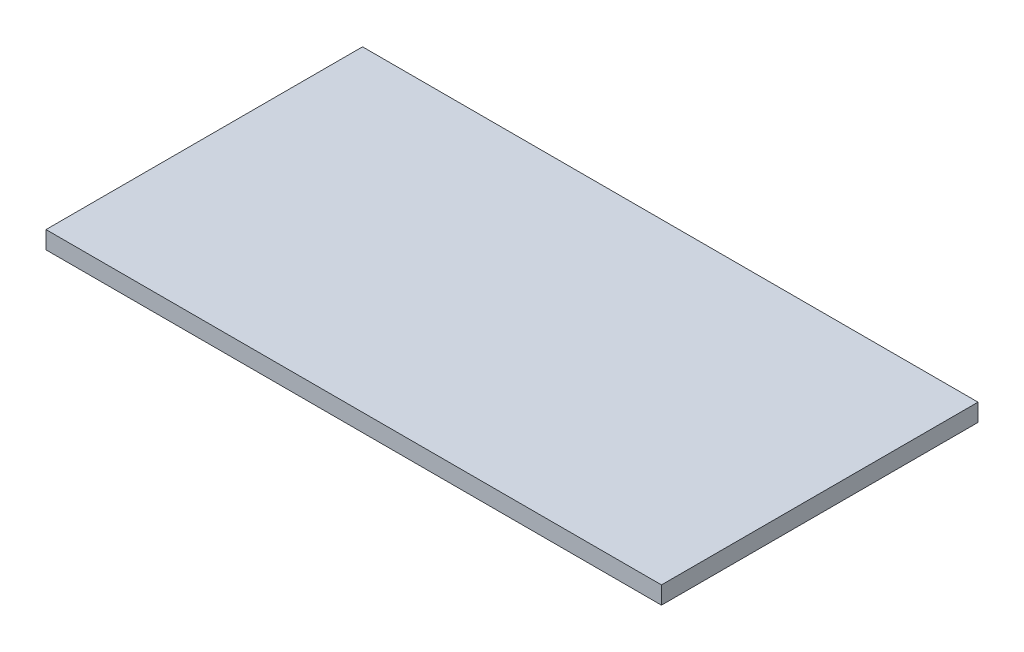
ISO-10303-21;
HEADER;
FILE_DESCRIPTION(('STEP AP214'),'2;1');
FILE_NAME('part.step','',(''),(''),'','','');
FILE_SCHEMA(('AUTOMOTIVE_DESIGN { 1 0 10303 214 1 1 1 1 }'));
ENDSEC;
DATA;
#1=APPLICATION_CONTEXT('core data for automotive mechanical design processes');
#2=APPLICATION_PROTOCOL_DEFINITION('international standard','automotive_design',2000,#1);
#3=PRODUCT_CONTEXT('',#1,'mechanical');
#4=PRODUCT('Part','Part','',(#3));
#5=PRODUCT_RELATED_PRODUCT_CATEGORY('part','',(#4));
#6=PRODUCT_DEFINITION_FORMATION('','',#4);
#7=PRODUCT_DEFINITION_CONTEXT('part definition',#1,'design');
#8=PRODUCT_DEFINITION('design','',#6,#7);
#9=PRODUCT_DEFINITION_SHAPE('','',#8);
#10=(LENGTH_UNIT() NAMED_UNIT(*) SI_UNIT(.MILLI.,.METRE.));
#11=(NAMED_UNIT(*) PLANE_ANGLE_UNIT() SI_UNIT($,.RADIAN.));
#12=(NAMED_UNIT(*) SI_UNIT($,.STERADIAN.) SOLID_ANGLE_UNIT());
#13=UNCERTAINTY_MEASURE_WITH_UNIT(LENGTH_MEASURE(1.E-05),#10,'distance_accuracy_value','');
#14=(GEOMETRIC_REPRESENTATION_CONTEXT(3) GLOBAL_UNCERTAINTY_ASSIGNED_CONTEXT((#13)) GLOBAL_UNIT_ASSIGNED_CONTEXT((#10,
#11,#12)) REPRESENTATION_CONTEXT('',''));
#15=CARTESIAN_POINT('',(0.,0.,0.));
#16=DIRECTION('',(0.,0.,1.));
#17=DIRECTION('',(1.,0.,0.));
#18=AXIS2_PLACEMENT_3D('',#15,#16,#17);
#19=CARTESIAN_POINT('',(0.,5.,0.));
#20=DIRECTION('',(1.,0.,0.));
#21=DIRECTION('',(0.,0.,-1.));
#22=AXIS2_PLACEMENT_3D('',#19,#20,#21);
#23=PLANE('',#22);
#24=DIRECTION('',(0.,0.,1.));
#25=VECTOR('',#24,1.);
#26=CARTESIAN_POINT('',(0.,0.,0.));
#27=LINE('',#26,#25);
#28=CARTESIAN_POINT('',(0.,0.,0.));
#29=VERTEX_POINT('',#28);
#30=CARTESIAN_POINT('',(0.,0.,90.));
#31=VERTEX_POINT('',#30);
#32=EDGE_CURVE('E95',#29,#31,#27,.T.);
#33=ORIENTED_EDGE('',*,*,#32,.T.);
#34=DIRECTION('',(0.,-1.,0.));
#35=VECTOR('',#34,1.);
#36=CARTESIAN_POINT('',(0.,5.,90.));
#37=LINE('',#36,#35);
#38=CARTESIAN_POINT('',(0.,5.,90.));
#39=VERTEX_POINT('',#38);
#40=EDGE_CURVE('E11',#39,#31,#37,.T.);
#41=ORIENTED_EDGE('',*,*,#40,.F.);
#42=DIRECTION('',(0.,0.,1.));
#43=VECTOR('',#42,1.);
#44=CARTESIAN_POINT('',(0.,5.,0.));
#45=LINE('',#44,#43);
#46=CARTESIAN_POINT('',(0.,5.,0.));
#47=VERTEX_POINT('',#46);
#48=EDGE_CURVE('E83',#47,#39,#45,.T.);
#49=ORIENTED_EDGE('',*,*,#48,.F.);
#50=DIRECTION('',(0.,-1.,0.));
#51=VECTOR('',#50,1.);
#52=CARTESIAN_POINT('',(0.,5.,0.));
#53=LINE('',#52,#51);
#54=EDGE_CURVE('E91',#47,#29,#53,.T.);
#55=ORIENTED_EDGE('',*,*,#54,.T.);
#56=EDGE_LOOP('',(#33,#41,#49,#55));
#57=FACE_BOUND('',#56,.T.);
#58=ADVANCED_FACE('F32',(#57),#23,.F.);
#59=CARTESIAN_POINT('',(0.,5.,90.));
#60=DIRECTION('',(0.,0.,-1.));
#61=DIRECTION('',(-1.,0.,0.));
#62=AXIS2_PLACEMENT_3D('',#59,#60,#61);
#63=PLANE('',#62);
#64=DIRECTION('',(1.,0.,0.));
#65=VECTOR('',#64,1.);
#66=CARTESIAN_POINT('',(0.,0.,90.));
#67=LINE('',#66,#65);
#68=CARTESIAN_POINT('',(175.,0.,90.));
#69=VERTEX_POINT('',#68);
#70=EDGE_CURVE('E87',#31,#69,#67,.T.);
#71=ORIENTED_EDGE('',*,*,#70,.T.);
#72=DIRECTION('',(0.,-1.,0.));
#73=VECTOR('',#72,1.);
#74=CARTESIAN_POINT('',(175.,5.,90.));
#75=LINE('',#74,#73);
#76=CARTESIAN_POINT('',(175.,5.,90.));
#77=VERTEX_POINT('',#76);
#78=EDGE_CURVE('E40',#77,#69,#75,.T.);
#79=ORIENTED_EDGE('',*,*,#78,.F.);
#80=DIRECTION('',(1.,0.,0.));
#81=VECTOR('',#80,1.);
#82=CARTESIAN_POINT('',(0.,5.,90.));
#83=LINE('',#82,#81);
#84=EDGE_CURVE('E78',#39,#77,#83,.T.);
#85=ORIENTED_EDGE('',*,*,#84,.F.);
#86=ORIENTED_EDGE('',*,*,#40,.T.);
#87=EDGE_LOOP('',(#71,#79,#85,#86));
#88=FACE_BOUND('',#87,.T.);
#89=ADVANCED_FACE('F86',(#88),#63,.F.);
#90=CARTESIAN_POINT('',(175.,5.,0.));
#91=DIRECTION('',(-1.,0.,0.));
#92=DIRECTION('',(0.,0.,1.));
#93=AXIS2_PLACEMENT_3D('',#90,#91,#92);
#94=PLANE('',#93);
#95=DIRECTION('',(0.,0.,-1.));
#96=VECTOR('',#95,1.);
#97=CARTESIAN_POINT('',(175.,0.,0.));
#98=LINE('',#97,#96);
#99=CARTESIAN_POINT('',(175.,0.,0.));
#100=VERTEX_POINT('',#99);
#101=EDGE_CURVE('E65',#69,#100,#98,.T.);
#102=ORIENTED_EDGE('',*,*,#101,.T.);
#103=DIRECTION('',(0.,-1.,0.));
#104=VECTOR('',#103,1.);
#105=CARTESIAN_POINT('',(175.,5.,0.));
#106=LINE('',#105,#104);
#107=CARTESIAN_POINT('',(175.,5.,0.));
#108=VERTEX_POINT('',#107);
#109=EDGE_CURVE('E88',#108,#100,#106,.T.);
#110=ORIENTED_EDGE('',*,*,#109,.F.);
#111=DIRECTION('',(0.,0.,-1.));
#112=VECTOR('',#111,1.);
#113=CARTESIAN_POINT('',(175.,5.,0.));
#114=LINE('',#113,#112);
#115=EDGE_CURVE('E81',#77,#108,#114,.T.);
#116=ORIENTED_EDGE('',*,*,#115,.F.);
#117=ORIENTED_EDGE('',*,*,#78,.T.);
#118=EDGE_LOOP('',(#102,#110,#116,#117));
#119=FACE_BOUND('',#118,.T.);
#120=ADVANCED_FACE('F89',(#119),#94,.F.);
#121=CARTESIAN_POINT('',(0.,5.,0.));
#122=DIRECTION('',(0.,0.,1.));
#123=DIRECTION('',(1.,0.,0.));
#124=AXIS2_PLACEMENT_3D('',#121,#122,#123);
#125=PLANE('',#124);
#126=DIRECTION('',(-1.,0.,0.));
#127=VECTOR('',#126,1.);
#128=CARTESIAN_POINT('',(0.,0.,0.));
#129=LINE('',#128,#127);
#130=EDGE_CURVE('E71',#100,#29,#129,.T.);
#131=ORIENTED_EDGE('',*,*,#130,.T.);
#132=ORIENTED_EDGE('',*,*,#54,.F.);
#133=DIRECTION('',(-1.,0.,0.));
#134=VECTOR('',#133,1.);
#135=CARTESIAN_POINT('',(0.,5.,0.));
#136=LINE('',#135,#134);
#137=EDGE_CURVE('E48',#108,#47,#136,.T.);
#138=ORIENTED_EDGE('',*,*,#137,.F.);
#139=ORIENTED_EDGE('',*,*,#109,.T.);
#140=EDGE_LOOP('',(#131,#132,#138,#139));
#141=FACE_BOUND('',#140,.T.);
#142=ADVANCED_FACE('F102',(#141),#125,.F.);
#143=CARTESIAN_POINT('',(0.,5.,0.));
#144=DIRECTION('',(0.,1.,0.));
#145=DIRECTION('',(0.,0.,1.));
#146=AXIS2_PLACEMENT_3D('',#143,#144,#145);
#147=PLANE('',#146);
#148=ORIENTED_EDGE('',*,*,#48,.T.);
#149=ORIENTED_EDGE('',*,*,#84,.T.);
#150=ORIENTED_EDGE('',*,*,#115,.T.);
#151=ORIENTED_EDGE('',*,*,#137,.T.);
#152=EDGE_LOOP('',(#148,#149,#150,#151));
#153=FACE_BOUND('',#152,.T.);
#154=ADVANCED_FACE('F79',(#153),#147,.T.);
#155=CARTESIAN_POINT('',(0.,0.,0.));
#156=DIRECTION('',(0.,1.,0.));
#157=DIRECTION('',(0.,0.,1.));
#158=AXIS2_PLACEMENT_3D('',#155,#156,#157);
#159=PLANE('',#158);
#160=ORIENTED_EDGE('',*,*,#32,.F.);
#161=ORIENTED_EDGE('',*,*,#130,.F.);
#162=ORIENTED_EDGE('',*,*,#101,.F.);
#163=ORIENTED_EDGE('',*,*,#70,.F.);
#164=EDGE_LOOP('',(#160,#161,#162,#163));
#165=FACE_BOUND('',#164,.T.);
#166=ADVANCED_FACE('F105',(#165),#159,.F.);
#167=CLOSED_SHELL('',(#58,#89,#120,#142,#154,#166));
#168=MANIFOLD_SOLID_BREP('B2',#167);
#169=ADVANCED_BREP_SHAPE_REPRESENTATION('',(#18,#168),#14);
#170=SHAPE_DEFINITION_REPRESENTATION(#9,#169);
ENDSEC;
END-ISO-10303-21;
